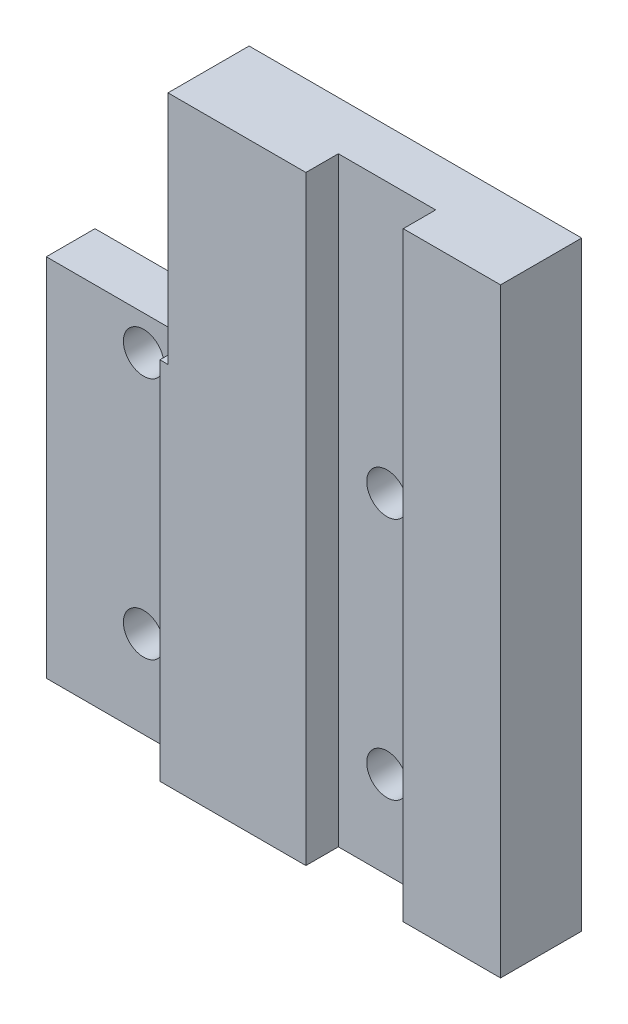
ISO-10303-21;
HEADER;
FILE_DESCRIPTION(('STEP AP214'),'2;1');
FILE_NAME('part.step','',(''),(''),'','','');
FILE_SCHEMA(('AUTOMOTIVE_DESIGN { 1 0 10303 214 1 1 1 1 }'));
ENDSEC;
DATA;
#1=APPLICATION_CONTEXT('core data for automotive mechanical design processes');
#2=APPLICATION_PROTOCOL_DEFINITION('international standard','automotive_design',2000,#1);
#3=PRODUCT_CONTEXT('',#1,'mechanical');
#4=PRODUCT('Part','Part','',(#3));
#5=PRODUCT_RELATED_PRODUCT_CATEGORY('part','',(#4));
#6=PRODUCT_DEFINITION_FORMATION('','',#4);
#7=PRODUCT_DEFINITION_CONTEXT('part definition',#1,'design');
#8=PRODUCT_DEFINITION('design','',#6,#7);
#9=PRODUCT_DEFINITION_SHAPE('','',#8);
#10=(LENGTH_UNIT() NAMED_UNIT(*) SI_UNIT(.MILLI.,.METRE.));
#11=(NAMED_UNIT(*) PLANE_ANGLE_UNIT() SI_UNIT($,.RADIAN.));
#12=(NAMED_UNIT(*) SI_UNIT($,.STERADIAN.) SOLID_ANGLE_UNIT());
#13=UNCERTAINTY_MEASURE_WITH_UNIT(LENGTH_MEASURE(1.E-05),#10,'distance_accuracy_value','');
#14=(GEOMETRIC_REPRESENTATION_CONTEXT(3) GLOBAL_UNCERTAINTY_ASSIGNED_CONTEXT((#13)) GLOBAL_UNIT_ASSIGNED_CONTEXT((#10,
#11,#12)) REPRESENTATION_CONTEXT('',''));
#15=CARTESIAN_POINT('',(0.,0.,0.));
#16=DIRECTION('',(0.,0.,1.));
#17=DIRECTION('',(1.,0.,0.));
#18=AXIS2_PLACEMENT_3D('',#15,#16,#17);
#19=CARTESIAN_POINT('',(0.,0.,0.));
#20=DIRECTION('',(0.,0.,-1.));
#21=DIRECTION('',(-1.,0.,0.));
#22=AXIS2_PLACEMENT_3D('',#19,#20,#21);
#23=PLANE('',#22);
#24=DIRECTION('',(1.,0.,0.));
#25=VECTOR('',#24,1.);
#26=CARTESIAN_POINT('',(60.,0.,0.));
#27=LINE('',#26,#25);
#28=CARTESIAN_POINT('',(0.,0.,0.));
#29=VERTEX_POINT('',#28);
#30=CARTESIAN_POINT('',(60.,0.,0.));
#31=VERTEX_POINT('',#30);
#32=EDGE_CURVE('E200',#29,#31,#27,.T.);
#33=ORIENTED_EDGE('',*,*,#32,.F.);
#34=DIRECTION('',(0.,-1.,0.));
#35=VECTOR('',#34,1.);
#36=CARTESIAN_POINT('',(0.,0.,0.));
#37=LINE('',#36,#35);
#38=CARTESIAN_POINT('',(0.,45.,0.));
#39=VERTEX_POINT('',#38);
#40=EDGE_CURVE('E221',#39,#29,#37,.T.);
#41=ORIENTED_EDGE('',*,*,#40,.F.);
#42=DIRECTION('',(-1.,0.,0.));
#43=VECTOR('',#42,1.);
#44=CARTESIAN_POINT('',(0.,45.,0.));
#45=LINE('',#44,#43);
#46=CARTESIAN_POINT('',(19.,45.,0.));
#47=VERTEX_POINT('',#46);
#48=EDGE_CURVE('E219',#47,#39,#45,.T.);
#49=ORIENTED_EDGE('',*,*,#48,.F.);
#50=DIRECTION('',(0.,-1.,0.));
#51=VECTOR('',#50,1.);
#52=CARTESIAN_POINT('',(19.,45.,0.));
#53=LINE('',#52,#51);
#54=CARTESIAN_POINT('',(19.,74.,0.));
#55=VERTEX_POINT('',#54);
#56=EDGE_CURVE('E217',#55,#47,#53,.T.);
#57=ORIENTED_EDGE('',*,*,#56,.F.);
#58=DIRECTION('',(-1.,0.,0.));
#59=VECTOR('',#58,1.);
#60=CARTESIAN_POINT('',(19.,74.,0.));
#61=LINE('',#60,#59);
#62=CARTESIAN_POINT('',(60.,74.,0.));
#63=VERTEX_POINT('',#62);
#64=EDGE_CURVE('E210',#63,#55,#61,.T.);
#65=ORIENTED_EDGE('',*,*,#64,.F.);
#66=DIRECTION('',(0.,1.,0.));
#67=VECTOR('',#66,1.);
#68=CARTESIAN_POINT('',(60.,74.,0.));
#69=LINE('',#68,#67);
#70=EDGE_CURVE('E205',#31,#63,#69,.T.);
#71=ORIENTED_EDGE('',*,*,#70,.F.);
#72=EDGE_LOOP('',(#33,#41,#49,#57,#65,#71));
#73=FACE_BOUND('',#72,.T.);
#74=CARTESIAN_POINT('',(42.,10.75,0.));
#75=DIRECTION('',(0.,0.,1.));
#76=DIRECTION('',(1.,0.,0.));
#77=AXIS2_PLACEMENT_3D('',#74,#75,#76);
#78=CIRCLE('',#77,2.49999999999995);
#79=CARTESIAN_POINT('',(44.5,10.75,0.));
#80=VERTEX_POINT('',#79);
#81=EDGE_CURVE('E156',#80,#80,#78,.T.);
#82=ORIENTED_EDGE('',*,*,#81,.T.);
#83=EDGE_LOOP('',(#82));
#84=FACE_BOUND('',#83,.T.);
#85=CARTESIAN_POINT('',(42.,40.75,0.));
#86=DIRECTION('',(0.,0.,1.));
#87=DIRECTION('',(1.,0.,0.));
#88=AXIS2_PLACEMENT_3D('',#85,#86,#87);
#89=CIRCLE('',#88,2.49999999999995);
#90=CARTESIAN_POINT('',(44.4999999999999,40.75,0.));
#91=VERTEX_POINT('',#90);
#92=EDGE_CURVE('E488',#91,#91,#89,.T.);
#93=ORIENTED_EDGE('',*,*,#92,.T.);
#94=EDGE_LOOP('',(#93));
#95=FACE_BOUND('',#94,.T.);
#96=CARTESIAN_POINT('',(12.,40.75,0.));
#97=DIRECTION('',(0.,0.,1.));
#98=DIRECTION('',(1.,0.,0.));
#99=AXIS2_PLACEMENT_3D('',#96,#97,#98);
#100=CIRCLE('',#99,2.49999999999994);
#101=CARTESIAN_POINT('',(14.4999999999999,40.75,0.));
#102=VERTEX_POINT('',#101);
#103=EDGE_CURVE('E482',#102,#102,#100,.T.);
#104=ORIENTED_EDGE('',*,*,#103,.T.);
#105=EDGE_LOOP('',(#104));
#106=FACE_BOUND('',#105,.T.);
#107=CARTESIAN_POINT('',(12.,10.75,0.));
#108=DIRECTION('',(0.,0.,1.));
#109=DIRECTION('',(1.,0.,0.));
#110=AXIS2_PLACEMENT_3D('',#107,#108,#109);
#111=CIRCLE('',#110,2.49999999999994);
#112=CARTESIAN_POINT('',(14.4999999999999,10.75,0.));
#113=VERTEX_POINT('',#112);
#114=EDGE_CURVE('E473',#113,#113,#111,.T.);
#115=ORIENTED_EDGE('',*,*,#114,.T.);
#116=EDGE_LOOP('',(#115));
#117=FACE_BOUND('',#116,.T.);
#118=ADVANCED_FACE('F34',(#73,#84,#95,#106,#117),#23,.T.);
#119=CARTESIAN_POINT('',(0.,0.,6.));
#120=DIRECTION('',(0.,0.,-1.));
#121=DIRECTION('',(-1.,0.,0.));
#122=AXIS2_PLACEMENT_3D('',#119,#120,#121);
#123=PLANE('',#122);
#124=CARTESIAN_POINT('',(12.,10.75,6.));
#125=DIRECTION('',(0.,0.,1.));
#126=DIRECTION('',(1.,0.,0.));
#127=AXIS2_PLACEMENT_3D('',#124,#125,#126);
#128=CIRCLE('',#127,2.49999999999999);
#129=CARTESIAN_POINT('',(14.5,10.75,6.));
#130=VERTEX_POINT('',#129);
#131=EDGE_CURVE('E475',#130,#130,#128,.T.);
#132=ORIENTED_EDGE('',*,*,#131,.F.);
#133=EDGE_LOOP('',(#132));
#134=FACE_BOUND('',#133,.T.);
#135=CARTESIAN_POINT('',(12.,40.75,6.));
#136=DIRECTION('',(0.,0.,1.));
#137=DIRECTION('',(1.,0.,0.));
#138=AXIS2_PLACEMENT_3D('',#135,#136,#137);
#139=CIRCLE('',#138,2.49999999999999);
#140=CARTESIAN_POINT('',(14.5,40.75,6.));
#141=VERTEX_POINT('',#140);
#142=EDGE_CURVE('E477',#141,#141,#139,.T.);
#143=ORIENTED_EDGE('',*,*,#142,.F.);
#144=EDGE_LOOP('',(#143));
#145=FACE_BOUND('',#144,.T.);
#146=DIRECTION('',(0.,-1.,0.));
#147=VECTOR('',#146,1.);
#148=CARTESIAN_POINT('',(18.,0.,6.));
#149=LINE('',#148,#147);
#150=CARTESIAN_POINT('',(18.,45.,6.));
#151=VERTEX_POINT('',#150);
#152=CARTESIAN_POINT('',(18.,0.,6.));
#153=VERTEX_POINT('',#152);
#154=EDGE_CURVE('E152',#151,#153,#149,.T.);
#155=ORIENTED_EDGE('',*,*,#154,.F.);
#156=DIRECTION('',(-1.,0.,0.));
#157=VECTOR('',#156,1.);
#158=CARTESIAN_POINT('',(0.,45.,6.));
#159=LINE('',#158,#157);
#160=CARTESIAN_POINT('',(0.,45.,6.));
#161=VERTEX_POINT('',#160);
#162=EDGE_CURVE('E233',#151,#161,#159,.T.);
#163=ORIENTED_EDGE('',*,*,#162,.T.);
#164=DIRECTION('',(0.,-1.,0.));
#165=VECTOR('',#164,1.);
#166=CARTESIAN_POINT('',(0.,0.,6.));
#167=LINE('',#166,#165);
#168=CARTESIAN_POINT('',(0.,0.,6.));
#169=VERTEX_POINT('',#168);
#170=EDGE_CURVE('E213',#161,#169,#167,.T.);
#171=ORIENTED_EDGE('',*,*,#170,.T.);
#172=DIRECTION('',(1.,0.,0.));
#173=VECTOR('',#172,1.);
#174=CARTESIAN_POINT('',(60.,0.,6.));
#175=LINE('',#174,#173);
#176=EDGE_CURVE('E60',#169,#153,#175,.T.);
#177=ORIENTED_EDGE('',*,*,#176,.T.);
#178=EDGE_LOOP('',(#155,#163,#171,#177));
#179=FACE_BOUND('',#178,.T.);
#180=ADVANCED_FACE('F265',(#134,#145,#179),#123,.F.);
#181=CARTESIAN_POINT('',(42.,40.75,6.));
#182=DIRECTION('',(0.,0.,1.));
#183=DIRECTION('',(1.,0.,0.));
#184=AXIS2_PLACEMENT_3D('',#181,#182,#183);
#185=CIRCLE('',#184,2.49999999999999);
#186=CARTESIAN_POINT('',(44.5,40.75,6.));
#187=VERTEX_POINT('',#186);
#188=EDGE_CURVE('E485',#187,#187,#185,.T.);
#189=ORIENTED_EDGE('',*,*,#188,.F.);
#190=EDGE_LOOP('',(#189));
#191=FACE_BOUND('',#190,.T.);
#192=CARTESIAN_POINT('',(42.,10.75,6.));
#193=DIRECTION('',(0.,0.,1.));
#194=DIRECTION('',(1.,0.,0.));
#195=AXIS2_PLACEMENT_3D('',#192,#193,#194);
#196=CIRCLE('',#195,2.49999999999999);
#197=CARTESIAN_POINT('',(44.5,10.75,6.));
#198=VERTEX_POINT('',#197);
#199=EDGE_CURVE('E490',#198,#198,#196,.T.);
#200=ORIENTED_EDGE('',*,*,#199,.F.);
#201=EDGE_LOOP('',(#200));
#202=FACE_BOUND('',#201,.T.);
#203=DIRECTION('',(-1.,0.,0.));
#204=VECTOR('',#203,1.);
#205=CARTESIAN_POINT('',(19.,74.,6.));
#206=LINE('',#205,#204);
#207=CARTESIAN_POINT('',(48.,74.,6.));
#208=VERTEX_POINT('',#207);
#209=CARTESIAN_POINT('',(36.,74.,6.));
#210=VERTEX_POINT('',#209);
#211=EDGE_CURVE('E192',#208,#210,#206,.T.);
#212=ORIENTED_EDGE('',*,*,#211,.T.);
#213=DIRECTION('',(0.,-1.,0.));
#214=VECTOR('',#213,1.);
#215=CARTESIAN_POINT('',(36.,0.,6.));
#216=LINE('',#215,#214);
#217=CARTESIAN_POINT('',(36.,0.,6.));
#218=VERTEX_POINT('',#217);
#219=EDGE_CURVE('E52',#210,#218,#216,.T.);
#220=ORIENTED_EDGE('',*,*,#219,.T.);
#221=CARTESIAN_POINT('',(48.,0.,6.));
#222=VERTEX_POINT('',#221);
#223=EDGE_CURVE('E38',#218,#222,#175,.T.);
#224=ORIENTED_EDGE('',*,*,#223,.T.);
#225=DIRECTION('',(0.,-1.,0.));
#226=VECTOR('',#225,1.);
#227=CARTESIAN_POINT('',(48.,0.,6.));
#228=LINE('',#227,#226);
#229=EDGE_CURVE('E135',#208,#222,#228,.T.);
#230=ORIENTED_EDGE('',*,*,#229,.F.);
#231=EDGE_LOOP('',(#212,#220,#224,#230));
#232=FACE_BOUND('',#231,.T.);
#233=ADVANCED_FACE('F234',(#191,#202,#232),#123,.F.);
#234=CARTESIAN_POINT('',(60.,0.,6.));
#235=DIRECTION('',(0.,1.,0.));
#236=DIRECTION('',(0.,0.,1.));
#237=AXIS2_PLACEMENT_3D('',#234,#235,#236);
#238=PLANE('',#237);
#239=ORIENTED_EDGE('',*,*,#32,.T.);
#240=DIRECTION('',(0.,0.,-1.));
#241=VECTOR('',#240,1.);
#242=CARTESIAN_POINT('',(60.,0.,6.));
#243=LINE('',#242,#241);
#244=CARTESIAN_POINT('',(60.,0.,10.));
#245=VERTEX_POINT('',#244);
#246=EDGE_CURVE('E11',#245,#31,#243,.T.);
#247=ORIENTED_EDGE('',*,*,#246,.F.);
#248=DIRECTION('',(1.,0.,0.));
#249=VECTOR('',#248,1.);
#250=CARTESIAN_POINT('',(0.,0.,10.));
#251=LINE('',#250,#249);
#252=CARTESIAN_POINT('',(48.,0.,10.));
#253=VERTEX_POINT('',#252);
#254=EDGE_CURVE('E178',#253,#245,#251,.T.);
#255=ORIENTED_EDGE('',*,*,#254,.F.);
#256=DIRECTION('',(0.,0.,-1.));
#257=VECTOR('',#256,1.);
#258=CARTESIAN_POINT('',(48.,0.,10.));
#259=LINE('',#258,#257);
#260=EDGE_CURVE('E184',#253,#222,#259,.T.);
#261=ORIENTED_EDGE('',*,*,#260,.T.);
#262=ORIENTED_EDGE('',*,*,#223,.F.);
#263=DIRECTION('',(0.,0.,-1.));
#264=VECTOR('',#263,1.);
#265=CARTESIAN_POINT('',(36.,0.,10.));
#266=LINE('',#265,#264);
#267=CARTESIAN_POINT('',(36.,0.,10.));
#268=VERTEX_POINT('',#267);
#269=EDGE_CURVE('E165',#268,#218,#266,.T.);
#270=ORIENTED_EDGE('',*,*,#269,.F.);
#271=DIRECTION('',(1.,0.,0.));
#272=VECTOR('',#271,1.);
#273=CARTESIAN_POINT('',(0.,0.,10.));
#274=LINE('',#273,#272);
#275=CARTESIAN_POINT('',(18.,0.,10.));
#276=VERTEX_POINT('',#275);
#277=EDGE_CURVE('E150',#276,#268,#274,.T.);
#278=ORIENTED_EDGE('',*,*,#277,.F.);
#279=DIRECTION('',(0.,0.,-1.));
#280=VECTOR('',#279,1.);
#281=CARTESIAN_POINT('',(18.,0.,10.));
#282=LINE('',#281,#280);
#283=EDGE_CURVE('E168',#276,#153,#282,.T.);
#284=ORIENTED_EDGE('',*,*,#283,.T.);
#285=ORIENTED_EDGE('',*,*,#176,.F.);
#286=DIRECTION('',(0.,0.,-1.));
#287=VECTOR('',#286,1.);
#288=CARTESIAN_POINT('',(0.,0.,6.));
#289=LINE('',#288,#287);
#290=EDGE_CURVE('E223',#169,#29,#289,.T.);
#291=ORIENTED_EDGE('',*,*,#290,.T.);
#292=EDGE_LOOP('',(#239,#247,#255,#261,#262,#270,#278,#284,#285,#291));
#293=FACE_BOUND('',#292,.T.);
#294=ADVANCED_FACE('F36',(#293),#238,.F.);
#295=CARTESIAN_POINT('',(60.,74.,6.));
#296=DIRECTION('',(-1.,0.,0.));
#297=DIRECTION('',(0.,0.,1.));
#298=AXIS2_PLACEMENT_3D('',#295,#296,#297);
#299=PLANE('',#298);
#300=ORIENTED_EDGE('',*,*,#70,.T.);
#301=DIRECTION('',(0.,0.,-1.));
#302=VECTOR('',#301,1.);
#303=CARTESIAN_POINT('',(60.,74.,6.));
#304=LINE('',#303,#302);
#305=CARTESIAN_POINT('',(60.,74.,10.));
#306=VERTEX_POINT('',#305);
#307=EDGE_CURVE('E44',#306,#63,#304,.T.);
#308=ORIENTED_EDGE('',*,*,#307,.F.);
#309=DIRECTION('',(0.,1.,0.));
#310=VECTOR('',#309,1.);
#311=CARTESIAN_POINT('',(60.,0.,10.));
#312=LINE('',#311,#310);
#313=EDGE_CURVE('E181',#245,#306,#312,.T.);
#314=ORIENTED_EDGE('',*,*,#313,.F.);
#315=ORIENTED_EDGE('',*,*,#246,.T.);
#316=EDGE_LOOP('',(#300,#308,#314,#315));
#317=FACE_BOUND('',#316,.T.);
#318=ADVANCED_FACE('F243',(#317),#299,.F.);
#319=CARTESIAN_POINT('',(19.,74.,6.));
#320=DIRECTION('',(0.,-1.,0.));
#321=DIRECTION('',(0.,0.,-1.));
#322=AXIS2_PLACEMENT_3D('',#319,#320,#321);
#323=PLANE('',#322);
#324=ORIENTED_EDGE('',*,*,#64,.T.);
#325=DIRECTION('',(0.,0.,-1.));
#326=VECTOR('',#325,1.);
#327=CARTESIAN_POINT('',(19.,74.,6.));
#328=LINE('',#327,#326);
#329=CARTESIAN_POINT('',(19.,74.,10.));
#330=VERTEX_POINT('',#329);
#331=EDGE_CURVE('E142',#330,#55,#328,.T.);
#332=ORIENTED_EDGE('',*,*,#331,.F.);
#333=DIRECTION('',(-1.,0.,0.));
#334=VECTOR('',#333,1.);
#335=CARTESIAN_POINT('',(0.,74.,10.));
#336=LINE('',#335,#334);
#337=CARTESIAN_POINT('',(36.,74.,10.));
#338=VERTEX_POINT('',#337);
#339=EDGE_CURVE('E139',#338,#330,#336,.T.);
#340=ORIENTED_EDGE('',*,*,#339,.F.);
#341=DIRECTION('',(0.,0.,-1.));
#342=VECTOR('',#341,1.);
#343=CARTESIAN_POINT('',(36.,74.,10.));
#344=LINE('',#343,#342);
#345=EDGE_CURVE('E127',#338,#210,#344,.T.);
#346=ORIENTED_EDGE('',*,*,#345,.T.);
#347=ORIENTED_EDGE('',*,*,#211,.F.);
#348=DIRECTION('',(0.,0.,-1.));
#349=VECTOR('',#348,1.);
#350=CARTESIAN_POINT('',(48.,74.,10.));
#351=LINE('',#350,#349);
#352=CARTESIAN_POINT('',(48.,74.,10.));
#353=VERTEX_POINT('',#352);
#354=EDGE_CURVE('E196',#353,#208,#351,.T.);
#355=ORIENTED_EDGE('',*,*,#354,.F.);
#356=DIRECTION('',(-1.,0.,0.));
#357=VECTOR('',#356,1.);
#358=CARTESIAN_POINT('',(0.,74.,10.));
#359=LINE('',#358,#357);
#360=EDGE_CURVE('E173',#306,#353,#359,.T.);
#361=ORIENTED_EDGE('',*,*,#360,.F.);
#362=ORIENTED_EDGE('',*,*,#307,.T.);
#363=EDGE_LOOP('',(#324,#332,#340,#346,#347,#355,#361,#362));
#364=FACE_BOUND('',#363,.T.);
#365=ADVANCED_FACE('F140',(#364),#323,.F.);
#366=CARTESIAN_POINT('',(19.,45.,6.));
#367=DIRECTION('',(1.,0.,0.));
#368=DIRECTION('',(0.,0.,-1.));
#369=AXIS2_PLACEMENT_3D('',#366,#367,#368);
#370=PLANE('',#369);
#371=ORIENTED_EDGE('',*,*,#56,.T.);
#372=DIRECTION('',(0.,0.,-1.));
#373=VECTOR('',#372,1.);
#374=CARTESIAN_POINT('',(19.,45.,6.));
#375=LINE('',#374,#373);
#376=CARTESIAN_POINT('',(19.,45.,10.));
#377=VERTEX_POINT('',#376);
#378=EDGE_CURVE('E228',#377,#47,#375,.T.);
#379=ORIENTED_EDGE('',*,*,#378,.F.);
#380=DIRECTION('',(0.,-1.,0.));
#381=VECTOR('',#380,1.);
#382=CARTESIAN_POINT('',(19.,0.,10.));
#383=LINE('',#382,#381);
#384=EDGE_CURVE('E146',#330,#377,#383,.T.);
#385=ORIENTED_EDGE('',*,*,#384,.F.);
#386=ORIENTED_EDGE('',*,*,#331,.T.);
#387=EDGE_LOOP('',(#371,#379,#385,#386));
#388=FACE_BOUND('',#387,.T.);
#389=ADVANCED_FACE('F251',(#388),#370,.F.);
#390=CARTESIAN_POINT('',(0.,45.,6.));
#391=DIRECTION('',(0.,-1.,0.));
#392=DIRECTION('',(0.,0.,-1.));
#393=AXIS2_PLACEMENT_3D('',#390,#391,#392);
#394=PLANE('',#393);
#395=ORIENTED_EDGE('',*,*,#48,.T.);
#396=DIRECTION('',(0.,0.,-1.));
#397=VECTOR('',#396,1.);
#398=CARTESIAN_POINT('',(0.,45.,6.));
#399=LINE('',#398,#397);
#400=EDGE_CURVE('E225',#161,#39,#399,.T.);
#401=ORIENTED_EDGE('',*,*,#400,.F.);
#402=ORIENTED_EDGE('',*,*,#162,.F.);
#403=DIRECTION('',(0.,0.,-1.));
#404=VECTOR('',#403,1.);
#405=CARTESIAN_POINT('',(18.,45.,10.));
#406=LINE('',#405,#404);
#407=CARTESIAN_POINT('',(18.,45.,10.));
#408=VERTEX_POINT('',#407);
#409=EDGE_CURVE('E136',#408,#151,#406,.T.);
#410=ORIENTED_EDGE('',*,*,#409,.F.);
#411=DIRECTION('',(-1.,0.,0.));
#412=VECTOR('',#411,1.);
#413=CARTESIAN_POINT('',(0.,45.,10.));
#414=LINE('',#413,#412);
#415=EDGE_CURVE('E160',#377,#408,#414,.T.);
#416=ORIENTED_EDGE('',*,*,#415,.F.);
#417=ORIENTED_EDGE('',*,*,#378,.T.);
#418=EDGE_LOOP('',(#395,#401,#402,#410,#416,#417));
#419=FACE_BOUND('',#418,.T.);
#420=ADVANCED_FACE('F254',(#419),#394,.F.);
#421=CARTESIAN_POINT('',(0.,0.,6.));
#422=DIRECTION('',(1.,0.,0.));
#423=DIRECTION('',(0.,0.,-1.));
#424=AXIS2_PLACEMENT_3D('',#421,#422,#423);
#425=PLANE('',#424);
#426=ORIENTED_EDGE('',*,*,#40,.T.);
#427=ORIENTED_EDGE('',*,*,#290,.F.);
#428=ORIENTED_EDGE('',*,*,#170,.F.);
#429=ORIENTED_EDGE('',*,*,#400,.T.);
#430=EDGE_LOOP('',(#426,#427,#428,#429));
#431=FACE_BOUND('',#430,.T.);
#432=ADVANCED_FACE('F264',(#431),#425,.F.);
#433=CARTESIAN_POINT('',(48.,0.,10.));
#434=DIRECTION('',(1.,0.,0.));
#435=DIRECTION('',(0.,1.,0.));
#436=AXIS2_PLACEMENT_3D('',#433,#434,#435);
#437=PLANE('',#436);
#438=ORIENTED_EDGE('',*,*,#229,.T.);
#439=ORIENTED_EDGE('',*,*,#260,.F.);
#440=DIRECTION('',(0.,-1.,0.));
#441=VECTOR('',#440,1.);
#442=CARTESIAN_POINT('',(48.,0.,10.));
#443=LINE('',#442,#441);
#444=EDGE_CURVE('E176',#353,#253,#443,.T.);
#445=ORIENTED_EDGE('',*,*,#444,.F.);
#446=ORIENTED_EDGE('',*,*,#354,.T.);
#447=EDGE_LOOP('',(#438,#439,#445,#446));
#448=FACE_BOUND('',#447,.T.);
#449=ADVANCED_FACE('F236',(#448),#437,.F.);
#450=CARTESIAN_POINT('',(0.,0.,10.));
#451=DIRECTION('',(0.,0.,1.));
#452=DIRECTION('',(1.,0.,0.));
#453=AXIS2_PLACEMENT_3D('',#450,#451,#452);
#454=PLANE('',#453);
#455=ORIENTED_EDGE('',*,*,#360,.T.);
#456=ORIENTED_EDGE('',*,*,#444,.T.);
#457=ORIENTED_EDGE('',*,*,#254,.T.);
#458=ORIENTED_EDGE('',*,*,#313,.T.);
#459=EDGE_LOOP('',(#455,#456,#457,#458));
#460=FACE_BOUND('',#459,.T.);
#461=ADVANCED_FACE('F240',(#460),#454,.T.);
#462=CARTESIAN_POINT('',(36.,0.,10.));
#463=DIRECTION('',(1.,0.,0.));
#464=DIRECTION('',(0.,1.,0.));
#465=AXIS2_PLACEMENT_3D('',#462,#463,#464);
#466=PLANE('',#465);
#467=ORIENTED_EDGE('',*,*,#219,.F.);
#468=ORIENTED_EDGE('',*,*,#345,.F.);
#469=DIRECTION('',(0.,-1.,0.));
#470=VECTOR('',#469,1.);
#471=CARTESIAN_POINT('',(36.,0.,10.));
#472=LINE('',#471,#470);
#473=EDGE_CURVE('E132',#338,#268,#472,.T.);
#474=ORIENTED_EDGE('',*,*,#473,.T.);
#475=ORIENTED_EDGE('',*,*,#269,.T.);
#476=EDGE_LOOP('',(#467,#468,#474,#475));
#477=FACE_BOUND('',#476,.T.);
#478=ADVANCED_FACE('F129',(#477),#466,.T.);
#479=CARTESIAN_POINT('',(18.,0.,10.));
#480=DIRECTION('',(1.,0.,0.));
#481=DIRECTION('',(0.,1.,0.));
#482=AXIS2_PLACEMENT_3D('',#479,#480,#481);
#483=PLANE('',#482);
#484=ORIENTED_EDGE('',*,*,#154,.T.);
#485=ORIENTED_EDGE('',*,*,#283,.F.);
#486=DIRECTION('',(0.,-1.,0.));
#487=VECTOR('',#486,1.);
#488=CARTESIAN_POINT('',(18.,0.,10.));
#489=LINE('',#488,#487);
#490=EDGE_CURVE('E162',#408,#276,#489,.T.);
#491=ORIENTED_EDGE('',*,*,#490,.F.);
#492=ORIENTED_EDGE('',*,*,#409,.T.);
#493=EDGE_LOOP('',(#484,#485,#491,#492));
#494=FACE_BOUND('',#493,.T.);
#495=ADVANCED_FACE('F260',(#494),#483,.F.);
#496=CARTESIAN_POINT('',(0.,0.,10.));
#497=DIRECTION('',(0.,0.,1.));
#498=DIRECTION('',(1.,0.,0.));
#499=AXIS2_PLACEMENT_3D('',#496,#497,#498);
#500=PLANE('',#499);
#501=ORIENTED_EDGE('',*,*,#473,.F.);
#502=ORIENTED_EDGE('',*,*,#339,.T.);
#503=ORIENTED_EDGE('',*,*,#384,.T.);
#504=ORIENTED_EDGE('',*,*,#415,.T.);
#505=ORIENTED_EDGE('',*,*,#490,.T.);
#506=ORIENTED_EDGE('',*,*,#277,.T.);
#507=EDGE_LOOP('',(#501,#502,#503,#504,#505,#506));
#508=FACE_BOUND('',#507,.T.);
#509=ADVANCED_FACE('F148',(#508),#500,.T.);
#510=CARTESIAN_POINT('',(42.,10.75,6.));
#511=DIRECTION('',(0.,0.,1.));
#512=DIRECTION('',(1.,0.,0.));
#513=AXIS2_PLACEMENT_3D('',#510,#511,#512);
#514=CYLINDRICAL_SURFACE('',#513,2.49999999999997);
#515=ORIENTED_EDGE('',*,*,#81,.F.);
#516=EDGE_LOOP('',(#515));
#517=FACE_BOUND('',#516,.T.);
#518=ORIENTED_EDGE('',*,*,#199,.T.);
#519=EDGE_LOOP('',(#518));
#520=FACE_BOUND('',#519,.T.);
#521=ADVANCED_FACE('F310',(#517,#520),#514,.F.);
#522=CARTESIAN_POINT('',(42.,40.75,6.));
#523=DIRECTION('',(0.,0.,1.));
#524=DIRECTION('',(1.,0.,0.));
#525=AXIS2_PLACEMENT_3D('',#522,#523,#524);
#526=CYLINDRICAL_SURFACE('',#525,2.49999999999997);
#527=ORIENTED_EDGE('',*,*,#92,.F.);
#528=EDGE_LOOP('',(#527));
#529=FACE_BOUND('',#528,.T.);
#530=ORIENTED_EDGE('',*,*,#188,.T.);
#531=EDGE_LOOP('',(#530));
#532=FACE_BOUND('',#531,.T.);
#533=ADVANCED_FACE('F315',(#529,#532),#526,.F.);
#534=CARTESIAN_POINT('',(12.,40.75,6.));
#535=DIRECTION('',(0.,0.,1.));
#536=DIRECTION('',(1.,0.,0.));
#537=AXIS2_PLACEMENT_3D('',#534,#535,#536);
#538=CYLINDRICAL_SURFACE('',#537,2.49999999999997);
#539=ORIENTED_EDGE('',*,*,#103,.F.);
#540=EDGE_LOOP('',(#539));
#541=FACE_BOUND('',#540,.T.);
#542=ORIENTED_EDGE('',*,*,#142,.T.);
#543=EDGE_LOOP('',(#542));
#544=FACE_BOUND('',#543,.T.);
#545=ADVANCED_FACE('F325',(#541,#544),#538,.F.);
#546=CARTESIAN_POINT('',(12.,10.75,6.));
#547=DIRECTION('',(0.,0.,1.));
#548=DIRECTION('',(1.,0.,0.));
#549=AXIS2_PLACEMENT_3D('',#546,#547,#548);
#550=CYLINDRICAL_SURFACE('',#549,2.49999999999997);
#551=ORIENTED_EDGE('',*,*,#114,.F.);
#552=EDGE_LOOP('',(#551));
#553=FACE_BOUND('',#552,.T.);
#554=ORIENTED_EDGE('',*,*,#131,.T.);
#555=EDGE_LOOP('',(#554));
#556=FACE_BOUND('',#555,.T.);
#557=ADVANCED_FACE('F345',(#553,#556),#550,.F.);
#558=CLOSED_SHELL('',(#118,#180,#233,#294,#318,#365,#389,#420,#432,#449,#461,#478,#495,#509,
#521,#533,#545,#557));
#559=MANIFOLD_SOLID_BREP('B2',#558);
#560=ADVANCED_BREP_SHAPE_REPRESENTATION('',(#18,#559),#14);
#561=SHAPE_DEFINITION_REPRESENTATION(#9,#560);
ENDSEC;
END-ISO-10303-21;
